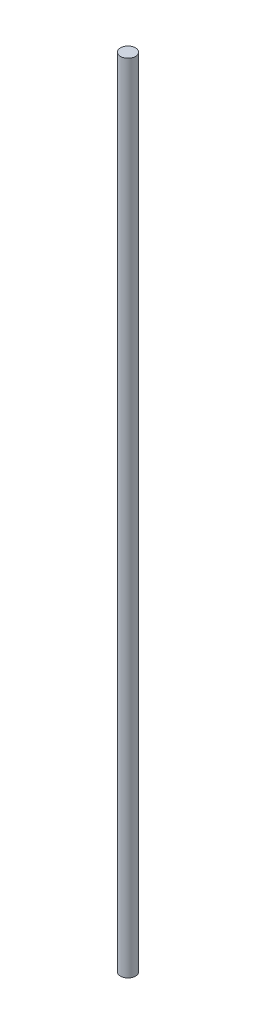
ISO-10303-21;
HEADER;
FILE_DESCRIPTION(('STEP AP214'),'2;1');
FILE_NAME('part.step','',(''),(''),'','','');
FILE_SCHEMA(('AUTOMOTIVE_DESIGN { 1 0 10303 214 1 1 1 1 }'));
ENDSEC;
DATA;
#1=APPLICATION_CONTEXT('core data for automotive mechanical design processes');
#2=APPLICATION_PROTOCOL_DEFINITION('international standard','automotive_design',2000,#1);
#3=PRODUCT_CONTEXT('',#1,'mechanical');
#4=PRODUCT('Part','Part','',(#3));
#5=PRODUCT_RELATED_PRODUCT_CATEGORY('part','',(#4));
#6=PRODUCT_DEFINITION_FORMATION('','',#4);
#7=PRODUCT_DEFINITION_CONTEXT('part definition',#1,'design');
#8=PRODUCT_DEFINITION('design','',#6,#7);
#9=PRODUCT_DEFINITION_SHAPE('','',#8);
#10=(LENGTH_UNIT() NAMED_UNIT(*) SI_UNIT(.MILLI.,.METRE.));
#11=(NAMED_UNIT(*) PLANE_ANGLE_UNIT() SI_UNIT($,.RADIAN.));
#12=(NAMED_UNIT(*) SI_UNIT($,.STERADIAN.) SOLID_ANGLE_UNIT());
#13=UNCERTAINTY_MEASURE_WITH_UNIT(LENGTH_MEASURE(1.E-05),#10,'distance_accuracy_value','');
#14=(GEOMETRIC_REPRESENTATION_CONTEXT(3) GLOBAL_UNCERTAINTY_ASSIGNED_CONTEXT((#13)) GLOBAL_UNIT_ASSIGNED_CONTEXT((#10,
#11,#12)) REPRESENTATION_CONTEXT('',''));
#15=CARTESIAN_POINT('',(0.,0.,0.));
#16=DIRECTION('',(0.,0.,1.));
#17=DIRECTION('',(1.,0.,0.));
#18=AXIS2_PLACEMENT_3D('',#15,#16,#17);
#19=CARTESIAN_POINT('',(0.,170.,0.));
#20=DIRECTION('',(0.,-1.,0.));
#21=DIRECTION('',(0.,0.,-1.));
#22=AXIS2_PLACEMENT_3D('',#19,#20,#21);
#23=CYLINDRICAL_SURFACE('',#22,1.6);
#24=CARTESIAN_POINT('',(0.,170.,0.));
#25=DIRECTION('',(0.,1.,0.));
#26=DIRECTION('',(0.,0.,1.));
#27=AXIS2_PLACEMENT_3D('',#24,#25,#26);
#28=CIRCLE('',#27,1.6);
#29=CARTESIAN_POINT('',(0.,170.,1.6));
#30=VERTEX_POINT('',#29);
#31=EDGE_CURVE('E10',#30,#30,#28,.T.);
#32=ORIENTED_EDGE('',*,*,#31,.F.);
#33=EDGE_LOOP('',(#32));
#34=FACE_BOUND('',#33,.T.);
#35=CARTESIAN_POINT('',(0.,0.,0.));
#36=DIRECTION('',(0.,1.,0.));
#37=DIRECTION('',(0.,0.,1.));
#38=AXIS2_PLACEMENT_3D('',#35,#36,#37);
#39=CIRCLE('',#38,1.6);
#40=CARTESIAN_POINT('',(0.,0.,1.6));
#41=VERTEX_POINT('',#40);
#42=EDGE_CURVE('E39',#41,#41,#39,.T.);
#43=ORIENTED_EDGE('',*,*,#42,.T.);
#44=EDGE_LOOP('',(#43));
#45=FACE_BOUND('',#44,.T.);
#46=ADVANCED_FACE('F36',(#34,#45),#23,.T.);
#47=CARTESIAN_POINT('',(0.,170.,0.));
#48=DIRECTION('',(0.,1.,0.));
#49=DIRECTION('',(0.,0.,1.));
#50=AXIS2_PLACEMENT_3D('',#47,#48,#49);
#51=PLANE('',#50);
#52=ORIENTED_EDGE('',*,*,#31,.T.);
#53=EDGE_LOOP('',(#52));
#54=FACE_BOUND('',#53,.T.);
#55=ADVANCED_FACE('F51',(#54),#51,.T.);
#56=CARTESIAN_POINT('',(0.,0.,0.));
#57=DIRECTION('',(0.,1.,0.));
#58=DIRECTION('',(0.,0.,1.));
#59=AXIS2_PLACEMENT_3D('',#56,#57,#58);
#60=PLANE('',#59);
#61=ORIENTED_EDGE('',*,*,#42,.F.);
#62=EDGE_LOOP('',(#61));
#63=FACE_BOUND('',#62,.T.);
#64=ADVANCED_FACE('F49',(#63),#60,.F.);
#65=CLOSED_SHELL('',(#46,#55,#64));
#66=MANIFOLD_SOLID_BREP('B2',#65);
#67=ADVANCED_BREP_SHAPE_REPRESENTATION('',(#18,#66),#14);
#68=SHAPE_DEFINITION_REPRESENTATION(#9,#67);
ENDSEC;
END-ISO-10303-21;
